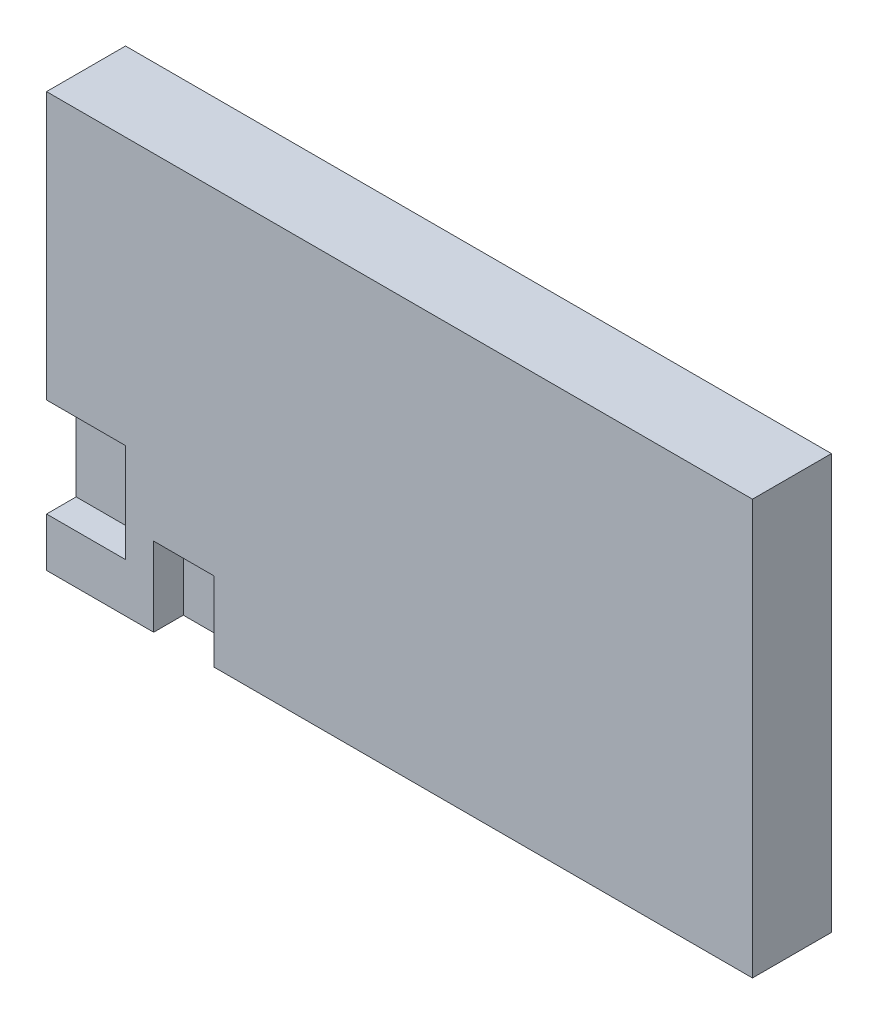
ISO-10303-21;
HEADER;
FILE_DESCRIPTION(('STEP AP214'),'2;1');
FILE_NAME('part.step','',(''),(''),'','','');
FILE_SCHEMA(('AUTOMOTIVE_DESIGN { 1 0 10303 214 1 1 1 1 }'));
ENDSEC;
DATA;
#1=APPLICATION_CONTEXT('core data for automotive mechanical design processes');
#2=APPLICATION_PROTOCOL_DEFINITION('international standard','automotive_design',2000,#1);
#3=PRODUCT_CONTEXT('',#1,'mechanical');
#4=PRODUCT('Part','Part','',(#3));
#5=PRODUCT_RELATED_PRODUCT_CATEGORY('part','',(#4));
#6=PRODUCT_DEFINITION_FORMATION('','',#4);
#7=PRODUCT_DEFINITION_CONTEXT('part definition',#1,'design');
#8=PRODUCT_DEFINITION('design','',#6,#7);
#9=PRODUCT_DEFINITION_SHAPE('','',#8);
#10=(LENGTH_UNIT() NAMED_UNIT(*) SI_UNIT(.MILLI.,.METRE.));
#11=(NAMED_UNIT(*) PLANE_ANGLE_UNIT() SI_UNIT($,.RADIAN.));
#12=(NAMED_UNIT(*) SI_UNIT($,.STERADIAN.) SOLID_ANGLE_UNIT());
#13=UNCERTAINTY_MEASURE_WITH_UNIT(LENGTH_MEASURE(1.E-05),#10,'distance_accuracy_value','');
#14=(GEOMETRIC_REPRESENTATION_CONTEXT(3) GLOBAL_UNCERTAINTY_ASSIGNED_CONTEXT((#13)) GLOBAL_UNIT_ASSIGNED_CONTEXT((#10,
#11,#12)) REPRESENTATION_CONTEXT('',''));
#15=CARTESIAN_POINT('',(0.,0.,0.));
#16=DIRECTION('',(0.,0.,1.));
#17=DIRECTION('',(1.,0.,0.));
#18=AXIS2_PLACEMENT_3D('',#15,#16,#17);
#19=CARTESIAN_POINT('',(-65.9063570612866,28.8380281690141,16.));
#20=DIRECTION('',(1.,0.,0.));
#21=DIRECTION('',(0.,1.,0.));
#22=AXIS2_PLACEMENT_3D('',#19,#20,#21);
#23=PLANE('',#22);
#24=DIRECTION('',(0.,-1.,0.));
#25=VECTOR('',#24,1.);
#26=CARTESIAN_POINT('',(-65.9063570612866,-25.2619718309859,10.));
#27=LINE('',#26,#25);
#28=CARTESIAN_POINT('',(-65.9063570612866,-25.2619718309859,10.));
#29=VERTEX_POINT('',#28);
#30=CARTESIAN_POINT('',(-65.9063570612866,-45.2619718309859,10.));
#31=VERTEX_POINT('',#30);
#32=EDGE_CURVE('E162',#29,#31,#27,.T.);
#33=ORIENTED_EDGE('',*,*,#32,.F.);
#34=DIRECTION('',(0.,0.,1.));
#35=VECTOR('',#34,1.);
#36=CARTESIAN_POINT('',(-65.9063570612866,-25.2619718309859,10.));
#37=LINE('',#36,#35);
#38=CARTESIAN_POINT('',(-65.9063570612866,-25.2619718309859,16.));
#39=VERTEX_POINT('',#38);
#40=EDGE_CURVE('E180',#29,#39,#37,.T.);
#41=ORIENTED_EDGE('',*,*,#40,.T.);
#42=DIRECTION('',(0.,-1.,0.));
#43=VECTOR('',#42,1.);
#44=CARTESIAN_POINT('',(-65.9063570612866,28.8380281690141,16.));
#45=LINE('',#44,#43);
#46=CARTESIAN_POINT('',(-65.9063570612866,28.8380281690141,16.));
#47=VERTEX_POINT('',#46);
#48=EDGE_CURVE('E189',#47,#39,#45,.T.);
#49=ORIENTED_EDGE('',*,*,#48,.F.);
#50=DIRECTION('',(0.,0.,-1.));
#51=VECTOR('',#50,1.);
#52=CARTESIAN_POINT('',(-65.9063570612866,28.8380281690141,16.));
#53=LINE('',#52,#51);
#54=CARTESIAN_POINT('',(-65.9063570612866,28.8380281690141,0.));
#55=VERTEX_POINT('',#54);
#56=EDGE_CURVE('E200',#47,#55,#53,.T.);
#57=ORIENTED_EDGE('',*,*,#56,.T.);
#58=DIRECTION('',(0.,-1.,0.));
#59=VECTOR('',#58,1.);
#60=CARTESIAN_POINT('',(-65.9063570612866,28.8380281690141,0.));
#61=LINE('',#60,#59);
#62=CARTESIAN_POINT('',(-65.9063570612866,-55.1619718309859,0.));
#63=VERTEX_POINT('',#62);
#64=EDGE_CURVE('E183',#55,#63,#61,.T.);
#65=ORIENTED_EDGE('',*,*,#64,.T.);
#66=DIRECTION('',(0.,0.,-1.));
#67=VECTOR('',#66,1.);
#68=CARTESIAN_POINT('',(-65.9063570612866,-55.1619718309859,16.));
#69=LINE('',#68,#67);
#70=CARTESIAN_POINT('',(-65.9063570612866,-55.1619718309859,16.));
#71=VERTEX_POINT('',#70);
#72=EDGE_CURVE('E11',#71,#63,#69,.T.);
#73=ORIENTED_EDGE('',*,*,#72,.F.);
#74=CARTESIAN_POINT('',(-65.9063570612866,-45.2619718309859,16.));
#75=VERTEX_POINT('',#74);
#76=EDGE_CURVE('E193',#75,#71,#45,.T.);
#77=ORIENTED_EDGE('',*,*,#76,.F.);
#78=DIRECTION('',(0.,0.,1.));
#79=VECTOR('',#78,1.);
#80=CARTESIAN_POINT('',(-65.9063570612866,-45.2619718309859,10.));
#81=LINE('',#80,#79);
#82=EDGE_CURVE('E55',#31,#75,#81,.T.);
#83=ORIENTED_EDGE('',*,*,#82,.F.);
#84=EDGE_LOOP('',(#33,#41,#49,#57,#65,#73,#77,#83));
#85=FACE_BOUND('',#84,.T.);
#86=ADVANCED_FACE('F33',(#85),#23,.F.);
#87=CARTESIAN_POINT('',(-65.9063570612866,-55.1619718309859,16.));
#88=DIRECTION('',(0.,1.,0.));
#89=DIRECTION('',(0.,0.,1.));
#90=AXIS2_PLACEMENT_3D('',#87,#88,#89);
#91=PLANE('',#90);
#92=DIRECTION('',(1.,0.,0.));
#93=VECTOR('',#92,1.);
#94=CARTESIAN_POINT('',(-44.2063570612866,-55.1619718309859,10.));
#95=LINE('',#94,#93);
#96=CARTESIAN_POINT('',(-44.2063570612866,-55.1619718309859,10.));
#97=VERTEX_POINT('',#96);
#98=CARTESIAN_POINT('',(-32.0063570612866,-55.1619718309859,10.));
#99=VERTEX_POINT('',#98);
#100=EDGE_CURVE('E140',#97,#99,#95,.T.);
#101=ORIENTED_EDGE('',*,*,#100,.F.);
#102=DIRECTION('',(0.,0.,1.));
#103=VECTOR('',#102,1.);
#104=CARTESIAN_POINT('',(-44.2063570612866,-55.1619718309859,10.));
#105=LINE('',#104,#103);
#106=CARTESIAN_POINT('',(-44.2063570612866,-55.1619718309859,16.));
#107=VERTEX_POINT('',#106);
#108=EDGE_CURVE('E123',#97,#107,#105,.T.);
#109=ORIENTED_EDGE('',*,*,#108,.T.);
#110=DIRECTION('',(1.,0.,0.));
#111=VECTOR('',#110,1.);
#112=CARTESIAN_POINT('',(-65.9063570612866,-55.1619718309859,16.));
#113=LINE('',#112,#111);
#114=EDGE_CURVE('E194',#71,#107,#113,.T.);
#115=ORIENTED_EDGE('',*,*,#114,.F.);
#116=ORIENTED_EDGE('',*,*,#72,.T.);
#117=DIRECTION('',(1.,0.,0.));
#118=VECTOR('',#117,1.);
#119=CARTESIAN_POINT('',(-65.9063570612866,-55.1619718309859,0.));
#120=LINE('',#119,#118);
#121=CARTESIAN_POINT('',(77.0936429387134,-55.1619718309859,0.));
#122=VERTEX_POINT('',#121);
#123=EDGE_CURVE('E203',#63,#122,#120,.T.);
#124=ORIENTED_EDGE('',*,*,#123,.T.);
#125=DIRECTION('',(0.,0.,-1.));
#126=VECTOR('',#125,1.);
#127=CARTESIAN_POINT('',(77.0936429387134,-55.1619718309859,16.));
#128=LINE('',#127,#126);
#129=CARTESIAN_POINT('',(77.0936429387134,-55.1619718309859,16.));
#130=VERTEX_POINT('',#129);
#131=EDGE_CURVE('E40',#130,#122,#128,.T.);
#132=ORIENTED_EDGE('',*,*,#131,.F.);
#133=CARTESIAN_POINT('',(-32.0063570612866,-55.1619718309859,16.));
#134=VERTEX_POINT('',#133);
#135=EDGE_CURVE('E192',#134,#130,#113,.T.);
#136=ORIENTED_EDGE('',*,*,#135,.F.);
#137=DIRECTION('',(0.,0.,1.));
#138=VECTOR('',#137,1.);
#139=CARTESIAN_POINT('',(-32.0063570612866,-55.1619718309859,10.));
#140=LINE('',#139,#138);
#141=EDGE_CURVE('E47',#99,#134,#140,.T.);
#142=ORIENTED_EDGE('',*,*,#141,.F.);
#143=EDGE_LOOP('',(#101,#109,#115,#116,#124,#132,#136,#142));
#144=FACE_BOUND('',#143,.T.);
#145=ADVANCED_FACE('F144',(#144),#91,.F.);
#146=CARTESIAN_POINT('',(77.0936429387134,28.8380281690141,16.));
#147=DIRECTION('',(-1.,0.,0.));
#148=DIRECTION('',(0.,-1.,0.));
#149=AXIS2_PLACEMENT_3D('',#146,#147,#148);
#150=PLANE('',#149);
#151=DIRECTION('',(0.,1.,0.));
#152=VECTOR('',#151,1.);
#153=CARTESIAN_POINT('',(77.0936429387134,28.8380281690141,0.));
#154=LINE('',#153,#152);
#155=CARTESIAN_POINT('',(77.0936429387134,28.8380281690141,0.));
#156=VERTEX_POINT('',#155);
#157=EDGE_CURVE('E205',#122,#156,#154,.T.);
#158=ORIENTED_EDGE('',*,*,#157,.T.);
#159=DIRECTION('',(0.,0.,-1.));
#160=VECTOR('',#159,1.);
#161=CARTESIAN_POINT('',(77.0936429387134,28.8380281690141,16.));
#162=LINE('',#161,#160);
#163=CARTESIAN_POINT('',(77.0936429387134,28.8380281690141,16.));
#164=VERTEX_POINT('',#163);
#165=EDGE_CURVE('E211',#164,#156,#162,.T.);
#166=ORIENTED_EDGE('',*,*,#165,.F.);
#167=DIRECTION('',(0.,1.,0.));
#168=VECTOR('',#167,1.);
#169=CARTESIAN_POINT('',(77.0936429387134,28.8380281690141,16.));
#170=LINE('',#169,#168);
#171=EDGE_CURVE('E196',#130,#164,#170,.T.);
#172=ORIENTED_EDGE('',*,*,#171,.F.);
#173=ORIENTED_EDGE('',*,*,#131,.T.);
#174=EDGE_LOOP('',(#158,#166,#172,#173));
#175=FACE_BOUND('',#174,.T.);
#176=ADVANCED_FACE('F218',(#175),#150,.F.);
#177=CARTESIAN_POINT('',(-65.9063570612866,28.8380281690141,16.));
#178=DIRECTION('',(0.,-1.,0.));
#179=DIRECTION('',(0.,0.,-1.));
#180=AXIS2_PLACEMENT_3D('',#177,#178,#179);
#181=PLANE('',#180);
#182=DIRECTION('',(-1.,0.,0.));
#183=VECTOR('',#182,1.);
#184=CARTESIAN_POINT('',(-65.9063570612866,28.8380281690141,0.));
#185=LINE('',#184,#183);
#186=EDGE_CURVE('E207',#156,#55,#185,.T.);
#187=ORIENTED_EDGE('',*,*,#186,.T.);
#188=ORIENTED_EDGE('',*,*,#56,.F.);
#189=DIRECTION('',(-1.,0.,0.));
#190=VECTOR('',#189,1.);
#191=CARTESIAN_POINT('',(-65.9063570612866,28.8380281690141,16.));
#192=LINE('',#191,#190);
#193=EDGE_CURVE('E198',#164,#47,#192,.T.);
#194=ORIENTED_EDGE('',*,*,#193,.F.);
#195=ORIENTED_EDGE('',*,*,#165,.T.);
#196=EDGE_LOOP('',(#187,#188,#194,#195));
#197=FACE_BOUND('',#196,.T.);
#198=ADVANCED_FACE('F226',(#197),#181,.F.);
#199=CARTESIAN_POINT('',(0.,0.,16.));
#200=DIRECTION('',(0.,0.,1.));
#201=DIRECTION('',(1.,0.,0.));
#202=AXIS2_PLACEMENT_3D('',#199,#200,#201);
#203=PLANE('',#202);
#204=DIRECTION('',(0.,-1.,0.));
#205=VECTOR('',#204,1.);
#206=CARTESIAN_POINT('',(-44.2063570612866,-39.1619718309859,16.));
#207=LINE('',#206,#205);
#208=CARTESIAN_POINT('',(-44.2063570612866,-39.1619718309859,16.));
#209=VERTEX_POINT('',#208);
#210=EDGE_CURVE('E129',#209,#107,#207,.T.);
#211=ORIENTED_EDGE('',*,*,#210,.F.);
#212=DIRECTION('',(-1.,0.,0.));
#213=VECTOR('',#212,1.);
#214=CARTESIAN_POINT('',(-44.2063570612866,-39.1619718309859,16.));
#215=LINE('',#214,#213);
#216=CARTESIAN_POINT('',(-32.0063570612866,-39.1619718309859,16.));
#217=VERTEX_POINT('',#216);
#218=EDGE_CURVE('E142',#217,#209,#215,.T.);
#219=ORIENTED_EDGE('',*,*,#218,.F.);
#220=DIRECTION('',(0.,1.,0.));
#221=VECTOR('',#220,1.);
#222=CARTESIAN_POINT('',(-32.0063570612866,-39.1619718309859,16.));
#223=LINE('',#222,#221);
#224=EDGE_CURVE('E152',#134,#217,#223,.T.);
#225=ORIENTED_EDGE('',*,*,#224,.F.);
#226=ORIENTED_EDGE('',*,*,#135,.T.);
#227=ORIENTED_EDGE('',*,*,#171,.T.);
#228=ORIENTED_EDGE('',*,*,#193,.T.);
#229=ORIENTED_EDGE('',*,*,#48,.T.);
#230=DIRECTION('',(-1.,0.,0.));
#231=VECTOR('',#230,1.);
#232=CARTESIAN_POINT('',(-65.9063570612866,-25.2619718309859,16.));
#233=LINE('',#232,#231);
#234=CARTESIAN_POINT('',(-49.9063570612866,-25.2619718309859,16.));
#235=VERTEX_POINT('',#234);
#236=EDGE_CURVE('E166',#235,#39,#233,.T.);
#237=ORIENTED_EDGE('',*,*,#236,.F.);
#238=DIRECTION('',(0.,1.,0.));
#239=VECTOR('',#238,1.);
#240=CARTESIAN_POINT('',(-49.9063570612866,-25.2619718309859,16.));
#241=LINE('',#240,#239);
#242=CARTESIAN_POINT('',(-49.9063570612866,-45.2619718309859,16.));
#243=VERTEX_POINT('',#242);
#244=EDGE_CURVE('E176',#243,#235,#241,.T.);
#245=ORIENTED_EDGE('',*,*,#244,.F.);
#246=DIRECTION('',(1.,0.,0.));
#247=VECTOR('',#246,1.);
#248=CARTESIAN_POINT('',(-65.9063570612866,-45.2619718309859,16.));
#249=LINE('',#248,#247);
#250=EDGE_CURVE('E158',#75,#243,#249,.T.);
#251=ORIENTED_EDGE('',*,*,#250,.F.);
#252=ORIENTED_EDGE('',*,*,#76,.T.);
#253=ORIENTED_EDGE('',*,*,#114,.T.);
#254=EDGE_LOOP('',(#211,#219,#225,#226,#227,#228,#229,#237,#245,#251,#252,#253));
#255=FACE_BOUND('',#254,.T.);
#256=ADVANCED_FACE('F234',(#255),#203,.T.);
#257=CARTESIAN_POINT('',(0.,0.,0.));
#258=DIRECTION('',(0.,0.,1.));
#259=DIRECTION('',(1.,0.,0.));
#260=AXIS2_PLACEMENT_3D('',#257,#258,#259);
#261=PLANE('',#260);
#262=ORIENTED_EDGE('',*,*,#64,.F.);
#263=ORIENTED_EDGE('',*,*,#186,.F.);
#264=ORIENTED_EDGE('',*,*,#157,.F.);
#265=ORIENTED_EDGE('',*,*,#123,.F.);
#266=EDGE_LOOP('',(#262,#263,#264,#265));
#267=FACE_BOUND('',#266,.T.);
#268=ADVANCED_FACE('F223',(#267),#261,.F.);
#269=CARTESIAN_POINT('',(-65.9063570612866,-25.2619718309859,10.));
#270=DIRECTION('',(0.,1.,0.));
#271=DIRECTION('',(0.,0.,1.));
#272=AXIS2_PLACEMENT_3D('',#269,#270,#271);
#273=PLANE('',#272);
#274=ORIENTED_EDGE('',*,*,#236,.T.);
#275=ORIENTED_EDGE('',*,*,#40,.F.);
#276=DIRECTION('',(-1.,0.,0.));
#277=VECTOR('',#276,1.);
#278=CARTESIAN_POINT('',(-65.9063570612866,-25.2619718309859,10.));
#279=LINE('',#278,#277);
#280=CARTESIAN_POINT('',(-49.9063570612866,-25.2619718309859,10.));
#281=VERTEX_POINT('',#280);
#282=EDGE_CURVE('E172',#281,#29,#279,.T.);
#283=ORIENTED_EDGE('',*,*,#282,.F.);
#284=DIRECTION('',(0.,0.,1.));
#285=VECTOR('',#284,1.);
#286=CARTESIAN_POINT('',(-49.9063570612866,-25.2619718309859,10.));
#287=LINE('',#286,#285);
#288=EDGE_CURVE('E184',#281,#235,#287,.T.);
#289=ORIENTED_EDGE('',*,*,#288,.T.);
#290=EDGE_LOOP('',(#274,#275,#283,#289));
#291=FACE_BOUND('',#290,.T.);
#292=ADVANCED_FACE('F246',(#291),#273,.F.);
#293=CARTESIAN_POINT('',(-49.9063570612866,-25.2619718309859,10.));
#294=DIRECTION('',(1.,0.,0.));
#295=DIRECTION('',(0.,0.,-1.));
#296=AXIS2_PLACEMENT_3D('',#293,#294,#295);
#297=PLANE('',#296);
#298=ORIENTED_EDGE('',*,*,#244,.T.);
#299=ORIENTED_EDGE('',*,*,#288,.F.);
#300=DIRECTION('',(0.,1.,0.));
#301=VECTOR('',#300,1.);
#302=CARTESIAN_POINT('',(-49.9063570612866,-25.2619718309859,10.));
#303=LINE('',#302,#301);
#304=CARTESIAN_POINT('',(-49.9063570612866,-45.2619718309859,10.));
#305=VERTEX_POINT('',#304);
#306=EDGE_CURVE('E169',#305,#281,#303,.T.);
#307=ORIENTED_EDGE('',*,*,#306,.F.);
#308=DIRECTION('',(0.,0.,1.));
#309=VECTOR('',#308,1.);
#310=CARTESIAN_POINT('',(-49.9063570612866,-45.2619718309859,10.));
#311=LINE('',#310,#309);
#312=EDGE_CURVE('E186',#305,#243,#311,.T.);
#313=ORIENTED_EDGE('',*,*,#312,.T.);
#314=EDGE_LOOP('',(#298,#299,#307,#313));
#315=FACE_BOUND('',#314,.T.);
#316=ADVANCED_FACE('F248',(#315),#297,.F.);
#317=CARTESIAN_POINT('',(-65.9063570612866,-45.2619718309859,10.));
#318=DIRECTION('',(0.,-1.,0.));
#319=DIRECTION('',(0.,0.,-1.));
#320=AXIS2_PLACEMENT_3D('',#317,#318,#319);
#321=PLANE('',#320);
#322=ORIENTED_EDGE('',*,*,#250,.T.);
#323=ORIENTED_EDGE('',*,*,#312,.F.);
#324=DIRECTION('',(1.,0.,0.));
#325=VECTOR('',#324,1.);
#326=CARTESIAN_POINT('',(-65.9063570612866,-45.2619718309859,10.));
#327=LINE('',#326,#325);
#328=EDGE_CURVE('E165',#31,#305,#327,.T.);
#329=ORIENTED_EDGE('',*,*,#328,.F.);
#330=ORIENTED_EDGE('',*,*,#82,.T.);
#331=EDGE_LOOP('',(#322,#323,#329,#330));
#332=FACE_BOUND('',#331,.T.);
#333=ADVANCED_FACE('F249',(#332),#321,.F.);
#334=CARTESIAN_POINT('',(0.,0.,10.));
#335=DIRECTION('',(0.,0.,1.));
#336=DIRECTION('',(1.,0.,0.));
#337=AXIS2_PLACEMENT_3D('',#334,#335,#336);
#338=PLANE('',#337);
#339=ORIENTED_EDGE('',*,*,#32,.T.);
#340=ORIENTED_EDGE('',*,*,#328,.T.);
#341=ORIENTED_EDGE('',*,*,#306,.T.);
#342=ORIENTED_EDGE('',*,*,#282,.T.);
#343=EDGE_LOOP('',(#339,#340,#341,#342));
#344=FACE_BOUND('',#343,.T.);
#345=ADVANCED_FACE('F242',(#344),#338,.T.);
#346=CARTESIAN_POINT('',(-44.2063570612866,-39.1619718309859,10.));
#347=DIRECTION('',(-1.,0.,0.));
#348=DIRECTION('',(0.,0.,1.));
#349=AXIS2_PLACEMENT_3D('',#346,#347,#348);
#350=PLANE('',#349);
#351=ORIENTED_EDGE('',*,*,#210,.T.);
#352=ORIENTED_EDGE('',*,*,#108,.F.);
#353=DIRECTION('',(0.,-1.,0.));
#354=VECTOR('',#353,1.);
#355=CARTESIAN_POINT('',(-44.2063570612866,-39.1619718309859,10.));
#356=LINE('',#355,#354);
#357=CARTESIAN_POINT('',(-44.2063570612866,-39.1619718309859,10.));
#358=VERTEX_POINT('',#357);
#359=EDGE_CURVE('E126',#358,#97,#356,.T.);
#360=ORIENTED_EDGE('',*,*,#359,.F.);
#361=DIRECTION('',(0.,0.,1.));
#362=VECTOR('',#361,1.);
#363=CARTESIAN_POINT('',(-44.2063570612866,-39.1619718309859,10.));
#364=LINE('',#363,#362);
#365=EDGE_CURVE('E156',#358,#209,#364,.T.);
#366=ORIENTED_EDGE('',*,*,#365,.T.);
#367=EDGE_LOOP('',(#351,#352,#360,#366));
#368=FACE_BOUND('',#367,.T.);
#369=ADVANCED_FACE('F125',(#368),#350,.F.);
#370=CARTESIAN_POINT('',(-44.2063570612866,-39.1619718309859,10.));
#371=DIRECTION('',(0.,1.,0.));
#372=DIRECTION('',(0.,0.,1.));
#373=AXIS2_PLACEMENT_3D('',#370,#371,#372);
#374=PLANE('',#373);
#375=ORIENTED_EDGE('',*,*,#218,.T.);
#376=ORIENTED_EDGE('',*,*,#365,.F.);
#377=DIRECTION('',(-1.,0.,0.));
#378=VECTOR('',#377,1.);
#379=CARTESIAN_POINT('',(-44.2063570612866,-39.1619718309859,10.));
#380=LINE('',#379,#378);
#381=CARTESIAN_POINT('',(-32.0063570612866,-39.1619718309859,10.));
#382=VERTEX_POINT('',#381);
#383=EDGE_CURVE('E134',#382,#358,#380,.T.);
#384=ORIENTED_EDGE('',*,*,#383,.F.);
#385=DIRECTION('',(0.,0.,1.));
#386=VECTOR('',#385,1.);
#387=CARTESIAN_POINT('',(-32.0063570612866,-39.1619718309859,10.));
#388=LINE('',#387,#386);
#389=EDGE_CURVE('E159',#382,#217,#388,.T.);
#390=ORIENTED_EDGE('',*,*,#389,.T.);
#391=EDGE_LOOP('',(#375,#376,#384,#390));
#392=FACE_BOUND('',#391,.T.);
#393=ADVANCED_FACE('F239',(#392),#374,.F.);
#394=CARTESIAN_POINT('',(-32.0063570612866,-39.1619718309859,10.));
#395=DIRECTION('',(1.,0.,0.));
#396=DIRECTION('',(0.,0.,-1.));
#397=AXIS2_PLACEMENT_3D('',#394,#395,#396);
#398=PLANE('',#397);
#399=ORIENTED_EDGE('',*,*,#224,.T.);
#400=ORIENTED_EDGE('',*,*,#389,.F.);
#401=DIRECTION('',(0.,1.,0.));
#402=VECTOR('',#401,1.);
#403=CARTESIAN_POINT('',(-32.0063570612866,-39.1619718309859,10.));
#404=LINE('',#403,#402);
#405=EDGE_CURVE('E146',#99,#382,#404,.T.);
#406=ORIENTED_EDGE('',*,*,#405,.F.);
#407=ORIENTED_EDGE('',*,*,#141,.T.);
#408=EDGE_LOOP('',(#399,#400,#406,#407));
#409=FACE_BOUND('',#408,.T.);
#410=ADVANCED_FACE('F237',(#409),#398,.F.);
#411=CARTESIAN_POINT('',(0.,0.,10.));
#412=DIRECTION('',(0.,0.,1.));
#413=DIRECTION('',(1.,0.,0.));
#414=AXIS2_PLACEMENT_3D('',#411,#412,#413);
#415=PLANE('',#414);
#416=ORIENTED_EDGE('',*,*,#359,.T.);
#417=ORIENTED_EDGE('',*,*,#100,.T.);
#418=ORIENTED_EDGE('',*,*,#405,.T.);
#419=ORIENTED_EDGE('',*,*,#383,.T.);
#420=EDGE_LOOP('',(#416,#417,#418,#419));
#421=FACE_BOUND('',#420,.T.);
#422=ADVANCED_FACE('F138',(#421),#415,.T.);
#423=CLOSED_SHELL('',(#86,#145,#176,#198,#256,#268,#292,#316,#333,#345,#369,#393,#410,#422));
#424=MANIFOLD_SOLID_BREP('B2',#423);
#425=ADVANCED_BREP_SHAPE_REPRESENTATION('',(#18,#424),#14);
#426=SHAPE_DEFINITION_REPRESENTATION(#9,#425);
ENDSEC;
END-ISO-10303-21;
